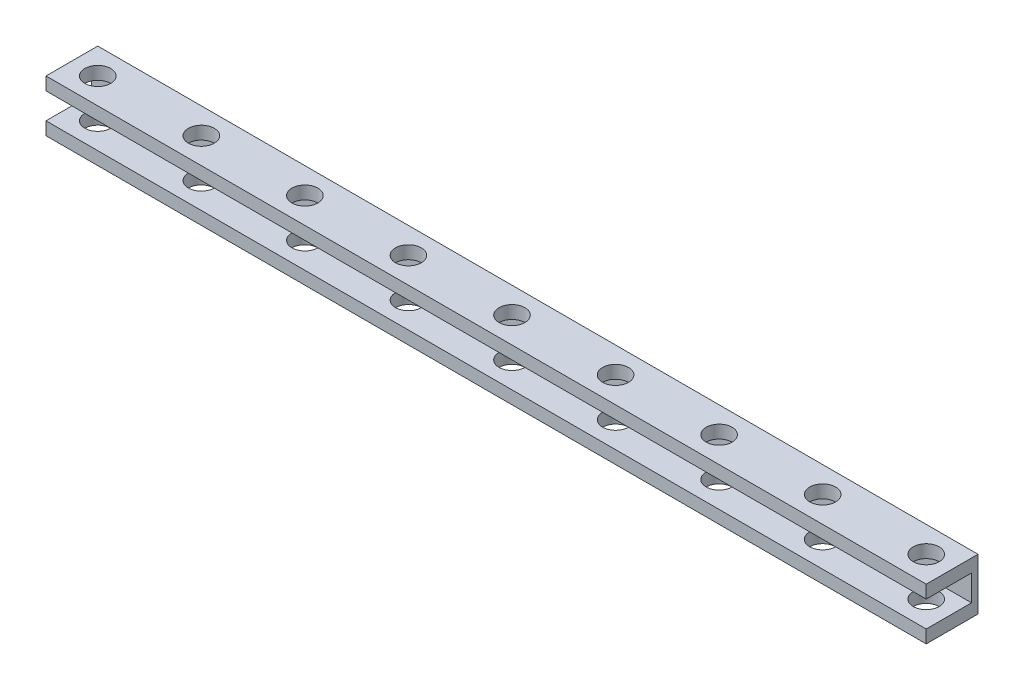
ISO-10303-21;
HEADER;
FILE_DESCRIPTION(('STEP AP214'),'2;1');
FILE_NAME('part.step','',(''),(''),'','','');
FILE_SCHEMA(('AUTOMOTIVE_DESIGN { 1 0 10303 214 1 1 1 1 }'));
ENDSEC;
DATA;
#1=APPLICATION_CONTEXT('core data for automotive mechanical design processes');
#2=APPLICATION_PROTOCOL_DEFINITION('international standard','automotive_design',2000,#1);
#3=PRODUCT_CONTEXT('',#1,'mechanical');
#4=PRODUCT('Part','Part','',(#3));
#5=PRODUCT_RELATED_PRODUCT_CATEGORY('part','',(#4));
#6=PRODUCT_DEFINITION_FORMATION('','',#4);
#7=PRODUCT_DEFINITION_CONTEXT('part definition',#1,'design');
#8=PRODUCT_DEFINITION('design','',#6,#7);
#9=PRODUCT_DEFINITION_SHAPE('','',#8);
#10=(LENGTH_UNIT() NAMED_UNIT(*) SI_UNIT(.MILLI.,.METRE.));
#11=(NAMED_UNIT(*) PLANE_ANGLE_UNIT() SI_UNIT($,.RADIAN.));
#12=(NAMED_UNIT(*) SI_UNIT($,.STERADIAN.) SOLID_ANGLE_UNIT());
#13=UNCERTAINTY_MEASURE_WITH_UNIT(LENGTH_MEASURE(1.E-05),#10,'distance_accuracy_value','');
#14=(GEOMETRIC_REPRESENTATION_CONTEXT(3) GLOBAL_UNCERTAINTY_ASSIGNED_CONTEXT((#13)) GLOBAL_UNIT_ASSIGNED_CONTEXT((#10,
#11,#12)) REPRESENTATION_CONTEXT('',''));
#15=CARTESIAN_POINT('',(0.,0.,0.));
#16=DIRECTION('',(0.,0.,1.));
#17=DIRECTION('',(1.,0.,0.));
#18=AXIS2_PLACEMENT_3D('',#15,#16,#17);
#19=CARTESIAN_POINT('',(-69.6967321316454,8.,-24.4399397140644));
#20=DIRECTION('',(0.,0.,-1.));
#21=DIRECTION('',(-1.,0.,0.));
#22=AXIS2_PLACEMENT_3D('',#19,#20,#21);
#23=PLANE('',#22);
#24=DIRECTION('',(0.,-1.,0.));
#25=VECTOR('',#24,1.);
#26=CARTESIAN_POINT('',(-69.6967321316454,8.,-24.4399397140644));
#27=LINE('',#26,#25);
#28=CARTESIAN_POINT('',(-69.6967321316454,8.,-24.4399397140644));
#29=VERTEX_POINT('',#28);
#30=CARTESIAN_POINT('',(-69.6967321316454,6.,-24.4399397140644));
#31=VERTEX_POINT('',#30);
#32=EDGE_CURVE('E168',#29,#31,#27,.T.);
#33=ORIENTED_EDGE('',*,*,#32,.T.);
#34=DIRECTION('',(-1.,0.,0.));
#35=VECTOR('',#34,1.);
#36=CARTESIAN_POINT('',(72.3032678683547,6.,-24.4399397140646));
#37=LINE('',#36,#35);
#38=CARTESIAN_POINT('',(66.3032678683546,6.,-24.4399397140646));
#39=VERTEX_POINT('',#38);
#40=EDGE_CURVE('E144',#39,#31,#37,.T.);
#41=ORIENTED_EDGE('',*,*,#40,.F.);
#42=DIRECTION('',(0.,-1.,0.));
#43=VECTOR('',#42,1.);
#44=CARTESIAN_POINT('',(66.3032678683546,8.,-24.4399397140644));
#45=LINE('',#44,#43);
#46=CARTESIAN_POINT('',(66.3032678683546,8.,-24.4399397140644));
#47=VERTEX_POINT('',#46);
#48=EDGE_CURVE('E165',#47,#39,#45,.T.);
#49=ORIENTED_EDGE('',*,*,#48,.F.);
#50=DIRECTION('',(1.,0.,0.));
#51=VECTOR('',#50,1.);
#52=CARTESIAN_POINT('',(-69.6967321316454,8.,-24.4399397140644));
#53=LINE('',#52,#51);
#54=EDGE_CURVE('E95',#29,#47,#53,.T.);
#55=ORIENTED_EDGE('',*,*,#54,.F.);
#56=EDGE_LOOP('',(#33,#41,#49,#55));
#57=FACE_BOUND('',#56,.T.);
#58=ADVANCED_FACE('F40',(#57),#23,.F.);
#59=CARTESIAN_POINT('',(-69.6967321316454,8.,-32.4399397140644));
#60=DIRECTION('',(1.,0.,0.));
#61=DIRECTION('',(0.,0.,-1.));
#62=AXIS2_PLACEMENT_3D('',#59,#60,#61);
#63=PLANE('',#62);
#64=DIRECTION('',(0.,-1.,0.));
#65=VECTOR('',#64,1.);
#66=CARTESIAN_POINT('',(-69.6967321316454,6.,-31.4399397140644));
#67=LINE('',#66,#65);
#68=CARTESIAN_POINT('',(-69.6967321316454,6.,-31.4399397140644));
#69=VERTEX_POINT('',#68);
#70=CARTESIAN_POINT('',(-69.6967321316454,2.,-31.4399397140644));
#71=VERTEX_POINT('',#70);
#72=EDGE_CURVE('E126',#69,#71,#67,.T.);
#73=ORIENTED_EDGE('',*,*,#72,.F.);
#74=DIRECTION('',(0.,0.,-1.));
#75=VECTOR('',#74,1.);
#76=CARTESIAN_POINT('',(-69.6967321316454,6.,-31.4399397140644));
#77=LINE('',#76,#75);
#78=EDGE_CURVE('E123',#31,#69,#77,.T.);
#79=ORIENTED_EDGE('',*,*,#78,.F.);
#80=ORIENTED_EDGE('',*,*,#32,.F.);
#81=DIRECTION('',(0.,0.,1.));
#82=VECTOR('',#81,1.);
#83=CARTESIAN_POINT('',(-69.6967321316454,8.,-32.4399397140644));
#84=LINE('',#83,#82);
#85=CARTESIAN_POINT('',(-69.6967321316454,8.,-32.4399397140644));
#86=VERTEX_POINT('',#85);
#87=EDGE_CURVE('E147',#86,#29,#84,.T.);
#88=ORIENTED_EDGE('',*,*,#87,.F.);
#89=DIRECTION('',(0.,-1.,0.));
#90=VECTOR('',#89,1.);
#91=CARTESIAN_POINT('',(-69.6967321316454,8.,-32.4399397140644));
#92=LINE('',#91,#90);
#93=CARTESIAN_POINT('',(-69.6967321316454,0.,-32.4399397140644));
#94=VERTEX_POINT('',#93);
#95=EDGE_CURVE('E153',#86,#94,#92,.T.);
#96=ORIENTED_EDGE('',*,*,#95,.T.);
#97=DIRECTION('',(0.,0.,1.));
#98=VECTOR('',#97,1.);
#99=CARTESIAN_POINT('',(-69.6967321316454,0.,-32.4399397140644));
#100=LINE('',#99,#98);
#101=CARTESIAN_POINT('',(-69.6967321316454,0.,-24.4399397140644));
#102=VERTEX_POINT('',#101);
#103=EDGE_CURVE('E143',#94,#102,#100,.T.);
#104=ORIENTED_EDGE('',*,*,#103,.T.);
#105=CARTESIAN_POINT('',(-69.6967321316454,2.,-24.4399397140644));
#106=VERTEX_POINT('',#105);
#107=EDGE_CURVE('E137',#106,#102,#27,.T.);
#108=ORIENTED_EDGE('',*,*,#107,.F.);
#109=DIRECTION('',(0.,0.,1.));
#110=VECTOR('',#109,1.);
#111=CARTESIAN_POINT('',(-69.6967321316454,2.,-31.4399397140644));
#112=LINE('',#111,#110);
#113=EDGE_CURVE('E119',#71,#106,#112,.T.);
#114=ORIENTED_EDGE('',*,*,#113,.F.);
#115=EDGE_LOOP('',(#73,#79,#80,#88,#96,#104,#108,#114));
#116=FACE_BOUND('',#115,.T.);
#117=ADVANCED_FACE('F42',(#116),#63,.F.);
#118=CARTESIAN_POINT('',(66.3032678683546,2.,-24.4399397140644));
#119=VERTEX_POINT('',#118);
#120=CARTESIAN_POINT('',(66.3032678683546,0.,-24.4399397140644));
#121=VERTEX_POINT('',#120);
#122=EDGE_CURVE('E164',#119,#121,#45,.T.);
#123=ORIENTED_EDGE('',*,*,#122,.F.);
#124=DIRECTION('',(-1.,0.,0.));
#125=VECTOR('',#124,1.);
#126=CARTESIAN_POINT('',(72.3032678683547,2.,-24.4399397140646));
#127=LINE('',#126,#125);
#128=EDGE_CURVE('E57',#119,#106,#127,.T.);
#129=ORIENTED_EDGE('',*,*,#128,.T.);
#130=ORIENTED_EDGE('',*,*,#107,.T.);
#131=DIRECTION('',(1.,0.,0.));
#132=VECTOR('',#131,1.);
#133=CARTESIAN_POINT('',(-69.6967321316454,0.,-24.4399397140644));
#134=LINE('',#133,#132);
#135=EDGE_CURVE('E155',#102,#121,#134,.T.);
#136=ORIENTED_EDGE('',*,*,#135,.T.);
#137=EDGE_LOOP('',(#123,#129,#130,#136));
#138=FACE_BOUND('',#137,.T.);
#139=ADVANCED_FACE('F256',(#138),#23,.F.);
#140=CARTESIAN_POINT('',(66.3032678683546,8.,-32.4399397140644));
#141=DIRECTION('',(-1.,0.,0.));
#142=DIRECTION('',(0.,0.,1.));
#143=AXIS2_PLACEMENT_3D('',#140,#141,#142);
#144=PLANE('',#143);
#145=ORIENTED_EDGE('',*,*,#48,.T.);
#146=DIRECTION('',(0.,0.,-1.));
#147=VECTOR('',#146,1.);
#148=CARTESIAN_POINT('',(66.3032678683546,6.,-32.4399397140644));
#149=LINE('',#148,#147);
#150=CARTESIAN_POINT('',(66.3032678683546,6.,-31.4399397140646));
#151=VERTEX_POINT('',#150);
#152=EDGE_CURVE('E11',#39,#151,#149,.T.);
#153=ORIENTED_EDGE('',*,*,#152,.T.);
#154=DIRECTION('',(0.,-1.,0.));
#155=VECTOR('',#154,1.);
#156=CARTESIAN_POINT('',(66.3032678683546,8.,-31.4399397140646));
#157=LINE('',#156,#155);
#158=CARTESIAN_POINT('',(66.3032678683546,2.,-31.4399397140646));
#159=VERTEX_POINT('',#158);
#160=EDGE_CURVE('E49',#151,#159,#157,.T.);
#161=ORIENTED_EDGE('',*,*,#160,.T.);
#162=DIRECTION('',(0.,0.,1.));
#163=VECTOR('',#162,1.);
#164=CARTESIAN_POINT('',(66.3032678683546,2.,-32.4399397140644));
#165=LINE('',#164,#163);
#166=EDGE_CURVE('E120',#159,#119,#165,.T.);
#167=ORIENTED_EDGE('',*,*,#166,.T.);
#168=ORIENTED_EDGE('',*,*,#122,.T.);
#169=DIRECTION('',(0.,0.,-1.));
#170=VECTOR('',#169,1.);
#171=CARTESIAN_POINT('',(66.3032678683546,0.,-32.4399397140644));
#172=LINE('',#171,#170);
#173=CARTESIAN_POINT('',(66.3032678683546,0.,-32.4399397140644));
#174=VERTEX_POINT('',#173);
#175=EDGE_CURVE('E158',#121,#174,#172,.T.);
#176=ORIENTED_EDGE('',*,*,#175,.T.);
#177=DIRECTION('',(0.,-1.,0.));
#178=VECTOR('',#177,1.);
#179=CARTESIAN_POINT('',(66.3032678683546,8.,-32.4399397140644));
#180=LINE('',#179,#178);
#181=CARTESIAN_POINT('',(66.3032678683546,8.,-32.4399397140644));
#182=VERTEX_POINT('',#181);
#183=EDGE_CURVE('E162',#182,#174,#180,.T.);
#184=ORIENTED_EDGE('',*,*,#183,.F.);
#185=DIRECTION('',(0.,0.,-1.));
#186=VECTOR('',#185,1.);
#187=CARTESIAN_POINT('',(66.3032678683546,8.,-32.4399397140644));
#188=LINE('',#187,#186);
#189=EDGE_CURVE('E150',#47,#182,#188,.T.);
#190=ORIENTED_EDGE('',*,*,#189,.F.);
#191=EDGE_LOOP('',(#145,#153,#161,#167,#168,#176,#184,#190));
#192=FACE_BOUND('',#191,.T.);
#193=ADVANCED_FACE('F262',(#192),#144,.F.);
#194=CARTESIAN_POINT('',(-69.6967321316454,8.,-32.4399397140644));
#195=DIRECTION('',(0.,0.,1.));
#196=DIRECTION('',(1.,0.,0.));
#197=AXIS2_PLACEMENT_3D('',#194,#195,#196);
#198=PLANE('',#197);
#199=DIRECTION('',(-1.,0.,0.));
#200=VECTOR('',#199,1.);
#201=CARTESIAN_POINT('',(-69.6967321316454,0.,-32.4399397140644));
#202=LINE('',#201,#200);
#203=EDGE_CURVE('E87',#174,#94,#202,.T.);
#204=ORIENTED_EDGE('',*,*,#203,.T.);
#205=ORIENTED_EDGE('',*,*,#95,.F.);
#206=DIRECTION('',(-1.,0.,0.));
#207=VECTOR('',#206,1.);
#208=CARTESIAN_POINT('',(-69.6967321316454,8.,-32.4399397140644));
#209=LINE('',#208,#207);
#210=EDGE_CURVE('E66',#182,#86,#209,.T.);
#211=ORIENTED_EDGE('',*,*,#210,.F.);
#212=ORIENTED_EDGE('',*,*,#183,.T.);
#213=EDGE_LOOP('',(#204,#205,#211,#212));
#214=FACE_BOUND('',#213,.T.);
#215=ADVANCED_FACE('F267',(#214),#198,.F.);
#216=CARTESIAN_POINT('',(0.,8.,0.));
#217=DIRECTION('',(0.,1.,0.));
#218=DIRECTION('',(0.,0.,1.));
#219=AXIS2_PLACEMENT_3D('',#216,#217,#218);
#220=PLANE('',#219);
#221=CARTESIAN_POINT('',(-65.6967321316454,8.,-28.4399397140644));
#222=DIRECTION('',(0.,1.,0.));
#223=DIRECTION('',(0.,0.,1.));
#224=AXIS2_PLACEMENT_3D('',#221,#222,#223);
#225=CIRCLE('',#224,2.);
#226=CARTESIAN_POINT('',(-65.6967321316454,8.,-26.4399397140644));
#227=VERTEX_POINT('',#226);
#228=EDGE_CURVE('E176',#227,#227,#225,.T.);
#229=ORIENTED_EDGE('',*,*,#228,.F.);
#230=EDGE_LOOP('',(#229));
#231=FACE_BOUND('',#230,.T.);
#232=CARTESIAN_POINT('',(-49.6967321316454,8.,-28.4399397140644));
#233=DIRECTION('',(0.,1.,0.));
#234=DIRECTION('',(0.,0.,1.));
#235=AXIS2_PLACEMENT_3D('',#232,#233,#234);
#236=CIRCLE('',#235,2.);
#237=CARTESIAN_POINT('',(-49.6967321316454,8.,-26.4399397140644));
#238=VERTEX_POINT('',#237);
#239=EDGE_CURVE('E484',#238,#238,#236,.T.);
#240=ORIENTED_EDGE('',*,*,#239,.F.);
#241=EDGE_LOOP('',(#240));
#242=FACE_BOUND('',#241,.T.);
#243=CARTESIAN_POINT('',(-33.6967321316454,8.,-28.4399397140644));
#244=DIRECTION('',(0.,1.,0.));
#245=DIRECTION('',(0.,0.,1.));
#246=AXIS2_PLACEMENT_3D('',#243,#244,#245);
#247=CIRCLE('',#246,2.);
#248=CARTESIAN_POINT('',(-33.6967321316454,8.,-26.4399397140644));
#249=VERTEX_POINT('',#248);
#250=EDGE_CURVE('E562',#249,#249,#247,.T.);
#251=ORIENTED_EDGE('',*,*,#250,.F.);
#252=EDGE_LOOP('',(#251));
#253=FACE_BOUND('',#252,.T.);
#254=CARTESIAN_POINT('',(-17.6967321316454,8.,-28.4399397140644));
#255=DIRECTION('',(0.,1.,0.));
#256=DIRECTION('',(0.,0.,1.));
#257=AXIS2_PLACEMENT_3D('',#254,#255,#256);
#258=CIRCLE('',#257,2.);
#259=CARTESIAN_POINT('',(-17.6967321316454,8.,-26.4399397140644));
#260=VERTEX_POINT('',#259);
#261=EDGE_CURVE('E559',#260,#260,#258,.T.);
#262=ORIENTED_EDGE('',*,*,#261,.F.);
#263=EDGE_LOOP('',(#262));
#264=FACE_BOUND('',#263,.T.);
#265=CARTESIAN_POINT('',(-1.69673213164542,8.,-28.4399397140644));
#266=DIRECTION('',(0.,1.,0.));
#267=DIRECTION('',(0.,0.,1.));
#268=AXIS2_PLACEMENT_3D('',#265,#266,#267);
#269=CIRCLE('',#268,2.);
#270=CARTESIAN_POINT('',(-1.69673213164542,8.,-26.4399397140644));
#271=VERTEX_POINT('',#270);
#272=EDGE_CURVE('E556',#271,#271,#269,.T.);
#273=ORIENTED_EDGE('',*,*,#272,.F.);
#274=EDGE_LOOP('',(#273));
#275=FACE_BOUND('',#274,.T.);
#276=CARTESIAN_POINT('',(14.3032678683546,8.,-28.4399397140644));
#277=DIRECTION('',(0.,1.,0.));
#278=DIRECTION('',(0.,0.,1.));
#279=AXIS2_PLACEMENT_3D('',#276,#277,#278);
#280=CIRCLE('',#279,2.);
#281=CARTESIAN_POINT('',(14.3032678683546,8.,-26.4399397140644));
#282=VERTEX_POINT('',#281);
#283=EDGE_CURVE('E553',#282,#282,#280,.T.);
#284=ORIENTED_EDGE('',*,*,#283,.F.);
#285=EDGE_LOOP('',(#284));
#286=FACE_BOUND('',#285,.T.);
#287=CARTESIAN_POINT('',(30.3032678683546,8.,-28.4399397140644));
#288=DIRECTION('',(0.,1.,0.));
#289=DIRECTION('',(0.,0.,1.));
#290=AXIS2_PLACEMENT_3D('',#287,#288,#289);
#291=CIRCLE('',#290,2.);
#292=CARTESIAN_POINT('',(30.3032678683546,8.,-26.4399397140644));
#293=VERTEX_POINT('',#292);
#294=EDGE_CURVE('E550',#293,#293,#291,.T.);
#295=ORIENTED_EDGE('',*,*,#294,.F.);
#296=EDGE_LOOP('',(#295));
#297=FACE_BOUND('',#296,.T.);
#298=CARTESIAN_POINT('',(46.3032678683546,8.,-28.4399397140644));
#299=DIRECTION('',(0.,1.,0.));
#300=DIRECTION('',(0.,0.,1.));
#301=AXIS2_PLACEMENT_3D('',#298,#299,#300);
#302=CIRCLE('',#301,2.);
#303=CARTESIAN_POINT('',(46.3032678683546,8.,-26.4399397140644));
#304=VERTEX_POINT('',#303);
#305=EDGE_CURVE('E547',#304,#304,#302,.T.);
#306=ORIENTED_EDGE('',*,*,#305,.F.);
#307=EDGE_LOOP('',(#306));
#308=FACE_BOUND('',#307,.T.);
#309=CARTESIAN_POINT('',(62.3032678683546,8.,-28.4399397140644));
#310=DIRECTION('',(0.,1.,0.));
#311=DIRECTION('',(0.,0.,1.));
#312=AXIS2_PLACEMENT_3D('',#309,#310,#311);
#313=CIRCLE('',#312,2.);
#314=CARTESIAN_POINT('',(62.3032678683546,8.,-26.4399397140644));
#315=VERTEX_POINT('',#314);
#316=EDGE_CURVE('E512',#315,#315,#313,.T.);
#317=ORIENTED_EDGE('',*,*,#316,.F.);
#318=EDGE_LOOP('',(#317));
#319=FACE_BOUND('',#318,.T.);
#320=ORIENTED_EDGE('',*,*,#87,.T.);
#321=ORIENTED_EDGE('',*,*,#54,.T.);
#322=ORIENTED_EDGE('',*,*,#189,.T.);
#323=ORIENTED_EDGE('',*,*,#210,.T.);
#324=EDGE_LOOP('',(#320,#321,#322,#323));
#325=FACE_BOUND('',#324,.T.);
#326=ADVANCED_FACE('F279',(#231,#242,#253,#264,#275,#286,#297,#308,#319,#325),#220,.T.);
#327=CARTESIAN_POINT('',(0.,0.,0.));
#328=DIRECTION('',(0.,1.,0.));
#329=DIRECTION('',(0.,0.,1.));
#330=AXIS2_PLACEMENT_3D('',#327,#328,#329);
#331=PLANE('',#330);
#332=CARTESIAN_POINT('',(-65.6967321316454,0.,-28.4399397140644));
#333=DIRECTION('',(0.,1.,0.));
#334=DIRECTION('',(0.,0.,1.));
#335=AXIS2_PLACEMENT_3D('',#332,#333,#334);
#336=CIRCLE('',#335,2.);
#337=CARTESIAN_POINT('',(-65.6967321316454,0.,-26.4399397140644));
#338=VERTEX_POINT('',#337);
#339=EDGE_CURVE('E133',#338,#338,#336,.T.);
#340=ORIENTED_EDGE('',*,*,#339,.T.);
#341=EDGE_LOOP('',(#340));
#342=FACE_BOUND('',#341,.T.);
#343=CARTESIAN_POINT('',(-49.6967321316454,0.,-28.4399397140644));
#344=DIRECTION('',(0.,1.,0.));
#345=DIRECTION('',(0.,0.,1.));
#346=AXIS2_PLACEMENT_3D('',#343,#344,#345);
#347=CIRCLE('',#346,2.);
#348=CARTESIAN_POINT('',(-49.6967321316454,0.,-26.4399397140644));
#349=VERTEX_POINT('',#348);
#350=EDGE_CURVE('E213',#349,#349,#347,.T.);
#351=ORIENTED_EDGE('',*,*,#350,.T.);
#352=EDGE_LOOP('',(#351));
#353=FACE_BOUND('',#352,.T.);
#354=CARTESIAN_POINT('',(-33.6967321316454,0.,-28.4399397140644));
#355=DIRECTION('',(0.,1.,0.));
#356=DIRECTION('',(0.,0.,1.));
#357=AXIS2_PLACEMENT_3D('',#354,#355,#356);
#358=CIRCLE('',#357,2.);
#359=CARTESIAN_POINT('',(-33.6967321316454,0.,-26.4399397140644));
#360=VERTEX_POINT('',#359);
#361=EDGE_CURVE('E209',#360,#360,#358,.T.);
#362=ORIENTED_EDGE('',*,*,#361,.T.);
#363=EDGE_LOOP('',(#362));
#364=FACE_BOUND('',#363,.T.);
#365=CARTESIAN_POINT('',(-17.6967321316454,0.,-28.4399397140644));
#366=DIRECTION('',(0.,1.,0.));
#367=DIRECTION('',(0.,0.,1.));
#368=AXIS2_PLACEMENT_3D('',#365,#366,#367);
#369=CIRCLE('',#368,2.);
#370=CARTESIAN_POINT('',(-17.6967321316454,0.,-26.4399397140644));
#371=VERTEX_POINT('',#370);
#372=EDGE_CURVE('E205',#371,#371,#369,.T.);
#373=ORIENTED_EDGE('',*,*,#372,.T.);
#374=EDGE_LOOP('',(#373));
#375=FACE_BOUND('',#374,.T.);
#376=CARTESIAN_POINT('',(-1.69673213164542,0.,-28.4399397140644));
#377=DIRECTION('',(0.,1.,0.));
#378=DIRECTION('',(0.,0.,1.));
#379=AXIS2_PLACEMENT_3D('',#376,#377,#378);
#380=CIRCLE('',#379,2.);
#381=CARTESIAN_POINT('',(-1.69673213164542,0.,-26.4399397140644));
#382=VERTEX_POINT('',#381);
#383=EDGE_CURVE('E201',#382,#382,#380,.T.);
#384=ORIENTED_EDGE('',*,*,#383,.T.);
#385=EDGE_LOOP('',(#384));
#386=FACE_BOUND('',#385,.T.);
#387=CARTESIAN_POINT('',(14.3032678683546,0.,-28.4399397140644));
#388=DIRECTION('',(0.,1.,0.));
#389=DIRECTION('',(0.,0.,1.));
#390=AXIS2_PLACEMENT_3D('',#387,#388,#389);
#391=CIRCLE('',#390,2.);
#392=CARTESIAN_POINT('',(14.3032678683546,0.,-26.4399397140644));
#393=VERTEX_POINT('',#392);
#394=EDGE_CURVE('E196',#393,#393,#391,.T.);
#395=ORIENTED_EDGE('',*,*,#394,.T.);
#396=EDGE_LOOP('',(#395));
#397=FACE_BOUND('',#396,.T.);
#398=CARTESIAN_POINT('',(30.3032678683546,0.,-28.4399397140644));
#399=DIRECTION('',(0.,1.,0.));
#400=DIRECTION('',(0.,0.,1.));
#401=AXIS2_PLACEMENT_3D('',#398,#399,#400);
#402=CIRCLE('',#401,2.);
#403=CARTESIAN_POINT('',(30.3032678683546,0.,-26.4399397140644));
#404=VERTEX_POINT('',#403);
#405=EDGE_CURVE('E191',#404,#404,#402,.T.);
#406=ORIENTED_EDGE('',*,*,#405,.T.);
#407=EDGE_LOOP('',(#406));
#408=FACE_BOUND('',#407,.T.);
#409=CARTESIAN_POINT('',(46.3032678683546,0.,-28.4399397140644));
#410=DIRECTION('',(0.,1.,0.));
#411=DIRECTION('',(0.,0.,1.));
#412=AXIS2_PLACEMENT_3D('',#409,#410,#411);
#413=CIRCLE('',#412,2.);
#414=CARTESIAN_POINT('',(46.3032678683546,0.,-26.4399397140644));
#415=VERTEX_POINT('',#414);
#416=EDGE_CURVE('E186',#415,#415,#413,.T.);
#417=ORIENTED_EDGE('',*,*,#416,.T.);
#418=EDGE_LOOP('',(#417));
#419=FACE_BOUND('',#418,.T.);
#420=CARTESIAN_POINT('',(62.3032678683546,0.,-28.4399397140644));
#421=DIRECTION('',(0.,1.,0.));
#422=DIRECTION('',(0.,0.,1.));
#423=AXIS2_PLACEMENT_3D('',#420,#421,#422);
#424=CIRCLE('',#423,2.);
#425=CARTESIAN_POINT('',(62.3032678683546,0.,-26.4399397140644));
#426=VERTEX_POINT('',#425);
#427=EDGE_CURVE('E181',#426,#426,#424,.T.);
#428=ORIENTED_EDGE('',*,*,#427,.T.);
#429=EDGE_LOOP('',(#428));
#430=FACE_BOUND('',#429,.T.);
#431=ORIENTED_EDGE('',*,*,#103,.F.);
#432=ORIENTED_EDGE('',*,*,#203,.F.);
#433=ORIENTED_EDGE('',*,*,#175,.F.);
#434=ORIENTED_EDGE('',*,*,#135,.F.);
#435=EDGE_LOOP('',(#431,#432,#433,#434));
#436=FACE_BOUND('',#435,.T.);
#437=ADVANCED_FACE('F230',(#342,#353,#364,#375,#386,#397,#408,#419,#430,#436),#331,.F.);
#438=CARTESIAN_POINT('',(72.3032678683547,6.,-31.4399397140646));
#439=DIRECTION('',(0.,0.,-1.));
#440=DIRECTION('',(-1.,0.,0.));
#441=AXIS2_PLACEMENT_3D('',#438,#439,#440);
#442=PLANE('',#441);
#443=DIRECTION('',(-1.,0.,0.));
#444=VECTOR('',#443,1.);
#445=CARTESIAN_POINT('',(72.3032678683547,6.,-31.4399397140646));
#446=LINE('',#445,#444);
#447=EDGE_CURVE('E129',#151,#69,#446,.T.);
#448=ORIENTED_EDGE('',*,*,#447,.T.);
#449=ORIENTED_EDGE('',*,*,#72,.T.);
#450=DIRECTION('',(-1.,0.,0.));
#451=VECTOR('',#450,1.);
#452=CARTESIAN_POINT('',(72.3032678683547,2.,-31.4399397140646));
#453=LINE('',#452,#451);
#454=EDGE_CURVE('E115',#159,#71,#453,.T.);
#455=ORIENTED_EDGE('',*,*,#454,.F.);
#456=ORIENTED_EDGE('',*,*,#160,.F.);
#457=EDGE_LOOP('',(#448,#449,#455,#456));
#458=FACE_BOUND('',#457,.T.);
#459=ADVANCED_FACE('F127',(#458),#442,.F.);
#460=CARTESIAN_POINT('',(72.3032678683547,6.,-31.4399397140646));
#461=DIRECTION('',(0.,1.,0.));
#462=DIRECTION('',(0.,0.,1.));
#463=AXIS2_PLACEMENT_3D('',#460,#461,#462);
#464=PLANE('',#463);
#465=CARTESIAN_POINT('',(-65.6967321316454,6.00000000000001,-28.4399397140644));
#466=DIRECTION('',(0.,1.,0.));
#467=DIRECTION('',(0.,0.,1.));
#468=AXIS2_PLACEMENT_3D('',#465,#466,#467);
#469=CIRCLE('',#468,2.);
#470=CARTESIAN_POINT('',(-65.6967321316454,6.00000000000001,-26.4399397140644));
#471=VERTEX_POINT('',#470);
#472=EDGE_CURVE('E225',#471,#471,#469,.T.);
#473=ORIENTED_EDGE('',*,*,#472,.T.);
#474=EDGE_LOOP('',(#473));
#475=FACE_BOUND('',#474,.T.);
#476=CARTESIAN_POINT('',(-49.6967321316454,6.00000000000001,-28.4399397140644));
#477=DIRECTION('',(0.,1.,0.));
#478=DIRECTION('',(0.,0.,1.));
#479=AXIS2_PLACEMENT_3D('',#476,#477,#478);
#480=CIRCLE('',#479,2.);
#481=CARTESIAN_POINT('',(-49.6967321316454,6.00000000000001,-26.4399397140644));
#482=VERTEX_POINT('',#481);
#483=EDGE_CURVE('E208',#482,#482,#480,.T.);
#484=ORIENTED_EDGE('',*,*,#483,.T.);
#485=EDGE_LOOP('',(#484));
#486=FACE_BOUND('',#485,.T.);
#487=CARTESIAN_POINT('',(-33.6967321316454,6.00000000000001,-28.4399397140644));
#488=DIRECTION('',(0.,1.,0.));
#489=DIRECTION('',(0.,0.,1.));
#490=AXIS2_PLACEMENT_3D('',#487,#488,#489);
#491=CIRCLE('',#490,2.);
#492=CARTESIAN_POINT('',(-33.6967321316454,6.00000000000001,-26.4399397140644));
#493=VERTEX_POINT('',#492);
#494=EDGE_CURVE('E204',#493,#493,#491,.T.);
#495=ORIENTED_EDGE('',*,*,#494,.T.);
#496=EDGE_LOOP('',(#495));
#497=FACE_BOUND('',#496,.T.);
#498=CARTESIAN_POINT('',(-17.6967321316454,6.00000000000001,-28.4399397140644));
#499=DIRECTION('',(0.,1.,0.));
#500=DIRECTION('',(0.,0.,1.));
#501=AXIS2_PLACEMENT_3D('',#498,#499,#500);
#502=CIRCLE('',#501,2.);
#503=CARTESIAN_POINT('',(-17.6967321316454,6.00000000000001,-26.4399397140644));
#504=VERTEX_POINT('',#503);
#505=EDGE_CURVE('E200',#504,#504,#502,.T.);
#506=ORIENTED_EDGE('',*,*,#505,.T.);
#507=EDGE_LOOP('',(#506));
#508=FACE_BOUND('',#507,.T.);
#509=CARTESIAN_POINT('',(-1.69673213164542,6.00000000000001,-28.4399397140644));
#510=DIRECTION('',(0.,1.,0.));
#511=DIRECTION('',(0.,0.,1.));
#512=AXIS2_PLACEMENT_3D('',#509,#510,#511);
#513=CIRCLE('',#512,2.);
#514=CARTESIAN_POINT('',(-1.69673213164542,6.00000000000001,-26.4399397140644));
#515=VERTEX_POINT('',#514);
#516=EDGE_CURVE('E195',#515,#515,#513,.T.);
#517=ORIENTED_EDGE('',*,*,#516,.T.);
#518=EDGE_LOOP('',(#517));
#519=FACE_BOUND('',#518,.T.);
#520=CARTESIAN_POINT('',(14.3032678683546,6.00000000000001,-28.4399397140644));
#521=DIRECTION('',(0.,1.,0.));
#522=DIRECTION('',(0.,0.,1.));
#523=AXIS2_PLACEMENT_3D('',#520,#521,#522);
#524=CIRCLE('',#523,2.);
#525=CARTESIAN_POINT('',(14.3032678683546,6.00000000000001,-26.4399397140644));
#526=VERTEX_POINT('',#525);
#527=EDGE_CURVE('E190',#526,#526,#524,.T.);
#528=ORIENTED_EDGE('',*,*,#527,.T.);
#529=EDGE_LOOP('',(#528));
#530=FACE_BOUND('',#529,.T.);
#531=CARTESIAN_POINT('',(30.3032678683546,6.00000000000001,-28.4399397140644));
#532=DIRECTION('',(0.,1.,0.));
#533=DIRECTION('',(0.,0.,1.));
#534=AXIS2_PLACEMENT_3D('',#531,#532,#533);
#535=CIRCLE('',#534,2.);
#536=CARTESIAN_POINT('',(30.3032678683546,6.00000000000001,-26.4399397140644));
#537=VERTEX_POINT('',#536);
#538=EDGE_CURVE('E185',#537,#537,#535,.T.);
#539=ORIENTED_EDGE('',*,*,#538,.T.);
#540=EDGE_LOOP('',(#539));
#541=FACE_BOUND('',#540,.T.);
#542=CARTESIAN_POINT('',(46.3032678683546,6.00000000000001,-28.4399397140644));
#543=DIRECTION('',(0.,1.,0.));
#544=DIRECTION('',(0.,0.,1.));
#545=AXIS2_PLACEMENT_3D('',#542,#543,#544);
#546=CIRCLE('',#545,2.);
#547=CARTESIAN_POINT('',(46.3032678683546,6.00000000000001,-26.4399397140644));
#548=VERTEX_POINT('',#547);
#549=EDGE_CURVE('E180',#548,#548,#546,.T.);
#550=ORIENTED_EDGE('',*,*,#549,.T.);
#551=EDGE_LOOP('',(#550));
#552=FACE_BOUND('',#551,.T.);
#553=CARTESIAN_POINT('',(62.3032678683546,6.00000000000001,-28.4399397140644));
#554=DIRECTION('',(0.,1.,0.));
#555=DIRECTION('',(0.,0.,1.));
#556=AXIS2_PLACEMENT_3D('',#553,#554,#555);
#557=CIRCLE('',#556,2.);
#558=CARTESIAN_POINT('',(62.3032678683546,6.00000000000001,-26.4399397140644));
#559=VERTEX_POINT('',#558);
#560=EDGE_CURVE('E175',#559,#559,#557,.T.);
#561=ORIENTED_EDGE('',*,*,#560,.T.);
#562=EDGE_LOOP('',(#561));
#563=FACE_BOUND('',#562,.T.);
#564=ORIENTED_EDGE('',*,*,#40,.T.);
#565=ORIENTED_EDGE('',*,*,#78,.T.);
#566=ORIENTED_EDGE('',*,*,#447,.F.);
#567=ORIENTED_EDGE('',*,*,#152,.F.);
#568=EDGE_LOOP('',(#564,#565,#566,#567));
#569=FACE_BOUND('',#568,.T.);
#570=ADVANCED_FACE('F274',(#475,#486,#497,#508,#519,#530,#541,#552,#563,#569),#464,.F.);
#571=CARTESIAN_POINT('',(72.3032678683547,2.,-31.4399397140646));
#572=DIRECTION('',(0.,-1.,0.));
#573=DIRECTION('',(0.,0.,-1.));
#574=AXIS2_PLACEMENT_3D('',#571,#572,#573);
#575=PLANE('',#574);
#576=CARTESIAN_POINT('',(-65.6967321316454,2.,-28.4399397140644));
#577=DIRECTION('',(0.,-1.,0.));
#578=DIRECTION('',(0.,0.,-1.));
#579=AXIS2_PLACEMENT_3D('',#576,#577,#578);
#580=CIRCLE('',#579,2.);
#581=CARTESIAN_POINT('',(-65.6967321316454,2.,-30.4399397140643));
#582=VERTEX_POINT('',#581);
#583=EDGE_CURVE('E44',#582,#582,#580,.T.);
#584=ORIENTED_EDGE('',*,*,#583,.T.);
#585=EDGE_LOOP('',(#584));
#586=FACE_BOUND('',#585,.T.);
#587=CARTESIAN_POINT('',(-49.6967321316454,2.,-28.4399397140644));
#588=DIRECTION('',(0.,-1.,0.));
#589=DIRECTION('',(0.,0.,-1.));
#590=AXIS2_PLACEMENT_3D('',#587,#588,#589);
#591=CIRCLE('',#590,2.);
#592=CARTESIAN_POINT('',(-49.6967321316454,2.,-30.4399397140644));
#593=VERTEX_POINT('',#592);
#594=EDGE_CURVE('E206',#593,#593,#591,.T.);
#595=ORIENTED_EDGE('',*,*,#594,.T.);
#596=EDGE_LOOP('',(#595));
#597=FACE_BOUND('',#596,.T.);
#598=CARTESIAN_POINT('',(-33.6967321316454,2.,-28.4399397140644));
#599=DIRECTION('',(0.,-1.,0.));
#600=DIRECTION('',(0.,0.,-1.));
#601=AXIS2_PLACEMENT_3D('',#598,#599,#600);
#602=CIRCLE('',#601,2.);
#603=CARTESIAN_POINT('',(-33.6967321316454,2.,-30.4399397140644));
#604=VERTEX_POINT('',#603);
#605=EDGE_CURVE('E202',#604,#604,#602,.T.);
#606=ORIENTED_EDGE('',*,*,#605,.T.);
#607=EDGE_LOOP('',(#606));
#608=FACE_BOUND('',#607,.T.);
#609=CARTESIAN_POINT('',(-17.6967321316454,2.,-28.4399397140644));
#610=DIRECTION('',(0.,-1.,0.));
#611=DIRECTION('',(0.,0.,-1.));
#612=AXIS2_PLACEMENT_3D('',#609,#610,#611);
#613=CIRCLE('',#612,2.);
#614=CARTESIAN_POINT('',(-17.6967321316454,2.,-30.4399397140644));
#615=VERTEX_POINT('',#614);
#616=EDGE_CURVE('E197',#615,#615,#613,.T.);
#617=ORIENTED_EDGE('',*,*,#616,.T.);
#618=EDGE_LOOP('',(#617));
#619=FACE_BOUND('',#618,.T.);
#620=CARTESIAN_POINT('',(-1.69673213164542,2.,-28.4399397140644));
#621=DIRECTION('',(0.,-1.,0.));
#622=DIRECTION('',(0.,0.,-1.));
#623=AXIS2_PLACEMENT_3D('',#620,#621,#622);
#624=CIRCLE('',#623,2.);
#625=CARTESIAN_POINT('',(-1.69673213164542,2.,-30.4399397140644));
#626=VERTEX_POINT('',#625);
#627=EDGE_CURVE('E192',#626,#626,#624,.T.);
#628=ORIENTED_EDGE('',*,*,#627,.T.);
#629=EDGE_LOOP('',(#628));
#630=FACE_BOUND('',#629,.T.);
#631=CARTESIAN_POINT('',(14.3032678683546,2.,-28.4399397140644));
#632=DIRECTION('',(0.,-1.,0.));
#633=DIRECTION('',(0.,0.,-1.));
#634=AXIS2_PLACEMENT_3D('',#631,#632,#633);
#635=CIRCLE('',#634,2.);
#636=CARTESIAN_POINT('',(14.3032678683546,2.,-30.4399397140644));
#637=VERTEX_POINT('',#636);
#638=EDGE_CURVE('E187',#637,#637,#635,.T.);
#639=ORIENTED_EDGE('',*,*,#638,.T.);
#640=EDGE_LOOP('',(#639));
#641=FACE_BOUND('',#640,.T.);
#642=CARTESIAN_POINT('',(30.3032678683546,2.,-28.4399397140644));
#643=DIRECTION('',(0.,-1.,0.));
#644=DIRECTION('',(0.,0.,-1.));
#645=AXIS2_PLACEMENT_3D('',#642,#643,#644);
#646=CIRCLE('',#645,2.);
#647=CARTESIAN_POINT('',(30.3032678683546,2.,-30.4399397140644));
#648=VERTEX_POINT('',#647);
#649=EDGE_CURVE('E182',#648,#648,#646,.T.);
#650=ORIENTED_EDGE('',*,*,#649,.T.);
#651=EDGE_LOOP('',(#650));
#652=FACE_BOUND('',#651,.T.);
#653=CARTESIAN_POINT('',(46.3032678683546,2.,-28.4399397140644));
#654=DIRECTION('',(0.,-1.,0.));
#655=DIRECTION('',(0.,0.,-1.));
#656=AXIS2_PLACEMENT_3D('',#653,#654,#655);
#657=CIRCLE('',#656,2.);
#658=CARTESIAN_POINT('',(46.3032678683546,2.,-30.4399397140644));
#659=VERTEX_POINT('',#658);
#660=EDGE_CURVE('E177',#659,#659,#657,.T.);
#661=ORIENTED_EDGE('',*,*,#660,.T.);
#662=EDGE_LOOP('',(#661));
#663=FACE_BOUND('',#662,.T.);
#664=CARTESIAN_POINT('',(62.3032678683546,2.,-28.4399397140644));
#665=DIRECTION('',(0.,-1.,0.));
#666=DIRECTION('',(0.,0.,-1.));
#667=AXIS2_PLACEMENT_3D('',#664,#665,#666);
#668=CIRCLE('',#667,2.);
#669=CARTESIAN_POINT('',(62.3032678683546,2.,-30.4399397140643));
#670=VERTEX_POINT('',#669);
#671=EDGE_CURVE('E172',#670,#670,#668,.T.);
#672=ORIENTED_EDGE('',*,*,#671,.T.);
#673=EDGE_LOOP('',(#672));
#674=FACE_BOUND('',#673,.T.);
#675=ORIENTED_EDGE('',*,*,#454,.T.);
#676=ORIENTED_EDGE('',*,*,#113,.T.);
#677=ORIENTED_EDGE('',*,*,#128,.F.);
#678=ORIENTED_EDGE('',*,*,#166,.F.);
#679=EDGE_LOOP('',(#675,#676,#677,#678));
#680=FACE_BOUND('',#679,.T.);
#681=ADVANCED_FACE('F117',(#586,#597,#608,#619,#630,#641,#652,#663,#674,#680),#575,.F.);
#682=CARTESIAN_POINT('',(62.3032678683546,-134.,-28.4399397140644));
#683=DIRECTION('',(0.,1.,0.));
#684=DIRECTION('',(0.,0.,1.));
#685=AXIS2_PLACEMENT_3D('',#682,#683,#684);
#686=CYLINDRICAL_SURFACE('',#685,2.);
#687=ORIENTED_EDGE('',*,*,#671,.F.);
#688=EDGE_LOOP('',(#687));
#689=FACE_BOUND('',#688,.T.);
#690=ORIENTED_EDGE('',*,*,#427,.F.);
#691=EDGE_LOOP('',(#690));
#692=FACE_BOUND('',#691,.T.);
#693=ADVANCED_FACE('F247',(#689,#692),#686,.F.);
#694=CARTESIAN_POINT('',(46.3032678683546,-134.,-28.4399397140644));
#695=DIRECTION('',(0.,1.,0.));
#696=DIRECTION('',(0.,0.,1.));
#697=AXIS2_PLACEMENT_3D('',#694,#695,#696);
#698=CYLINDRICAL_SURFACE('',#697,2.);
#699=ORIENTED_EDGE('',*,*,#660,.F.);
#700=EDGE_LOOP('',(#699));
#701=FACE_BOUND('',#700,.T.);
#702=ORIENTED_EDGE('',*,*,#416,.F.);
#703=EDGE_LOOP('',(#702));
#704=FACE_BOUND('',#703,.T.);
#705=ADVANCED_FACE('F336',(#701,#704),#698,.F.);
#706=CARTESIAN_POINT('',(30.3032678683546,-134.,-28.4399397140644));
#707=DIRECTION('',(0.,1.,0.));
#708=DIRECTION('',(0.,0.,1.));
#709=AXIS2_PLACEMENT_3D('',#706,#707,#708);
#710=CYLINDRICAL_SURFACE('',#709,2.);
#711=ORIENTED_EDGE('',*,*,#649,.F.);
#712=EDGE_LOOP('',(#711));
#713=FACE_BOUND('',#712,.T.);
#714=ORIENTED_EDGE('',*,*,#405,.F.);
#715=EDGE_LOOP('',(#714));
#716=FACE_BOUND('',#715,.T.);
#717=ADVANCED_FACE('F345',(#713,#716),#710,.F.);
#718=CARTESIAN_POINT('',(14.3032678683546,-134.,-28.4399397140644));
#719=DIRECTION('',(0.,1.,0.));
#720=DIRECTION('',(0.,0.,1.));
#721=AXIS2_PLACEMENT_3D('',#718,#719,#720);
#722=CYLINDRICAL_SURFACE('',#721,2.);
#723=ORIENTED_EDGE('',*,*,#638,.F.);
#724=EDGE_LOOP('',(#723));
#725=FACE_BOUND('',#724,.T.);
#726=ORIENTED_EDGE('',*,*,#394,.F.);
#727=EDGE_LOOP('',(#726));
#728=FACE_BOUND('',#727,.T.);
#729=ADVANCED_FACE('F355',(#725,#728),#722,.F.);
#730=CARTESIAN_POINT('',(-1.69673213164542,-134.,-28.4399397140644));
#731=DIRECTION('',(0.,1.,0.));
#732=DIRECTION('',(0.,0.,1.));
#733=AXIS2_PLACEMENT_3D('',#730,#731,#732);
#734=CYLINDRICAL_SURFACE('',#733,2.);
#735=ORIENTED_EDGE('',*,*,#627,.F.);
#736=EDGE_LOOP('',(#735));
#737=FACE_BOUND('',#736,.T.);
#738=ORIENTED_EDGE('',*,*,#383,.F.);
#739=EDGE_LOOP('',(#738));
#740=FACE_BOUND('',#739,.T.);
#741=ADVANCED_FACE('F366',(#737,#740),#734,.F.);
#742=CARTESIAN_POINT('',(-17.6967321316454,-134.,-28.4399397140644));
#743=DIRECTION('',(0.,1.,0.));
#744=DIRECTION('',(0.,0.,1.));
#745=AXIS2_PLACEMENT_3D('',#742,#743,#744);
#746=CYLINDRICAL_SURFACE('',#745,2.);
#747=ORIENTED_EDGE('',*,*,#616,.F.);
#748=EDGE_LOOP('',(#747));
#749=FACE_BOUND('',#748,.T.);
#750=ORIENTED_EDGE('',*,*,#372,.F.);
#751=EDGE_LOOP('',(#750));
#752=FACE_BOUND('',#751,.T.);
#753=ADVANCED_FACE('F377',(#749,#752),#746,.F.);
#754=CARTESIAN_POINT('',(-33.6967321316454,-134.,-28.4399397140644));
#755=DIRECTION('',(0.,1.,0.));
#756=DIRECTION('',(0.,0.,1.));
#757=AXIS2_PLACEMENT_3D('',#754,#755,#756);
#758=CYLINDRICAL_SURFACE('',#757,2.);
#759=ORIENTED_EDGE('',*,*,#605,.F.);
#760=EDGE_LOOP('',(#759));
#761=FACE_BOUND('',#760,.T.);
#762=ORIENTED_EDGE('',*,*,#361,.F.);
#763=EDGE_LOOP('',(#762));
#764=FACE_BOUND('',#763,.T.);
#765=ADVANCED_FACE('F248',(#761,#764),#758,.F.);
#766=CARTESIAN_POINT('',(-49.6967321316454,-134.,-28.4399397140644));
#767=DIRECTION('',(0.,1.,0.));
#768=DIRECTION('',(0.,0.,1.));
#769=AXIS2_PLACEMENT_3D('',#766,#767,#768);
#770=CYLINDRICAL_SURFACE('',#769,2.);
#771=ORIENTED_EDGE('',*,*,#594,.F.);
#772=EDGE_LOOP('',(#771));
#773=FACE_BOUND('',#772,.T.);
#774=ORIENTED_EDGE('',*,*,#350,.F.);
#775=EDGE_LOOP('',(#774));
#776=FACE_BOUND('',#775,.T.);
#777=ADVANCED_FACE('F236',(#773,#776),#770,.F.);
#778=CARTESIAN_POINT('',(-65.6967321316454,-134.,-28.4399397140644));
#779=DIRECTION('',(0.,1.,0.));
#780=DIRECTION('',(0.,0.,1.));
#781=AXIS2_PLACEMENT_3D('',#778,#779,#780);
#782=CYLINDRICAL_SURFACE('',#781,2.);
#783=ORIENTED_EDGE('',*,*,#583,.F.);
#784=EDGE_LOOP('',(#783));
#785=FACE_BOUND('',#784,.T.);
#786=ORIENTED_EDGE('',*,*,#339,.F.);
#787=EDGE_LOOP('',(#786));
#788=FACE_BOUND('',#787,.T.);
#789=ADVANCED_FACE('F233',(#785,#788),#782,.F.);
#790=ORIENTED_EDGE('',*,*,#316,.T.);
#791=EDGE_LOOP('',(#790));
#792=FACE_BOUND('',#791,.T.);
#793=ORIENTED_EDGE('',*,*,#560,.F.);
#794=EDGE_LOOP('',(#793));
#795=FACE_BOUND('',#794,.T.);
#796=ADVANCED_FACE('F235',(#792,#795),#686,.F.);
#797=ORIENTED_EDGE('',*,*,#305,.T.);
#798=EDGE_LOOP('',(#797));
#799=FACE_BOUND('',#798,.T.);
#800=ORIENTED_EDGE('',*,*,#549,.F.);
#801=EDGE_LOOP('',(#800));
#802=FACE_BOUND('',#801,.T.);
#803=ADVANCED_FACE('F244',(#799,#802),#698,.F.);
#804=ORIENTED_EDGE('',*,*,#294,.T.);
#805=EDGE_LOOP('',(#804));
#806=FACE_BOUND('',#805,.T.);
#807=ORIENTED_EDGE('',*,*,#538,.F.);
#808=EDGE_LOOP('',(#807));
#809=FACE_BOUND('',#808,.T.);
#810=ADVANCED_FACE('F358',(#806,#809),#710,.F.);
#811=ORIENTED_EDGE('',*,*,#283,.T.);
#812=EDGE_LOOP('',(#811));
#813=FACE_BOUND('',#812,.T.);
#814=ORIENTED_EDGE('',*,*,#527,.F.);
#815=EDGE_LOOP('',(#814));
#816=FACE_BOUND('',#815,.T.);
#817=ADVANCED_FACE('F369',(#813,#816),#722,.F.);
#818=ORIENTED_EDGE('',*,*,#272,.T.);
#819=EDGE_LOOP('',(#818));
#820=FACE_BOUND('',#819,.T.);
#821=ORIENTED_EDGE('',*,*,#516,.F.);
#822=EDGE_LOOP('',(#821));
#823=FACE_BOUND('',#822,.T.);
#824=ADVANCED_FACE('F380',(#820,#823),#734,.F.);
#825=ORIENTED_EDGE('',*,*,#261,.T.);
#826=EDGE_LOOP('',(#825));
#827=FACE_BOUND('',#826,.T.);
#828=ORIENTED_EDGE('',*,*,#505,.F.);
#829=EDGE_LOOP('',(#828));
#830=FACE_BOUND('',#829,.T.);
#831=ADVANCED_FACE('F390',(#827,#830),#746,.F.);
#832=ORIENTED_EDGE('',*,*,#250,.T.);
#833=EDGE_LOOP('',(#832));
#834=FACE_BOUND('',#833,.T.);
#835=ORIENTED_EDGE('',*,*,#494,.F.);
#836=EDGE_LOOP('',(#835));
#837=FACE_BOUND('',#836,.T.);
#838=ADVANCED_FACE('F400',(#834,#837),#758,.F.);
#839=ORIENTED_EDGE('',*,*,#239,.T.);
#840=EDGE_LOOP('',(#839));
#841=FACE_BOUND('',#840,.T.);
#842=ORIENTED_EDGE('',*,*,#483,.F.);
#843=EDGE_LOOP('',(#842));
#844=FACE_BOUND('',#843,.T.);
#845=ADVANCED_FACE('F251',(#841,#844),#770,.F.);
#846=ORIENTED_EDGE('',*,*,#228,.T.);
#847=EDGE_LOOP('',(#846));
#848=FACE_BOUND('',#847,.T.);
#849=ORIENTED_EDGE('',*,*,#472,.F.);
#850=EDGE_LOOP('',(#849));
#851=FACE_BOUND('',#850,.T.);
#852=ADVANCED_FACE('F239',(#848,#851),#782,.F.);
#853=CLOSED_SHELL('',(#58,#117,#139,#193,#215,#326,#437,#459,#570,#681,#693,#705,#717,#729,#741,
#753,#765,#777,#789,#796,#803,#810,#817,#824,#831,#838,#845,#852));
#854=MANIFOLD_SOLID_BREP('B2',#853);
#855=ADVANCED_BREP_SHAPE_REPRESENTATION('',(#18,#854),#14);
#856=SHAPE_DEFINITION_REPRESENTATION(#9,#855);
ENDSEC;
END-ISO-10303-21;
